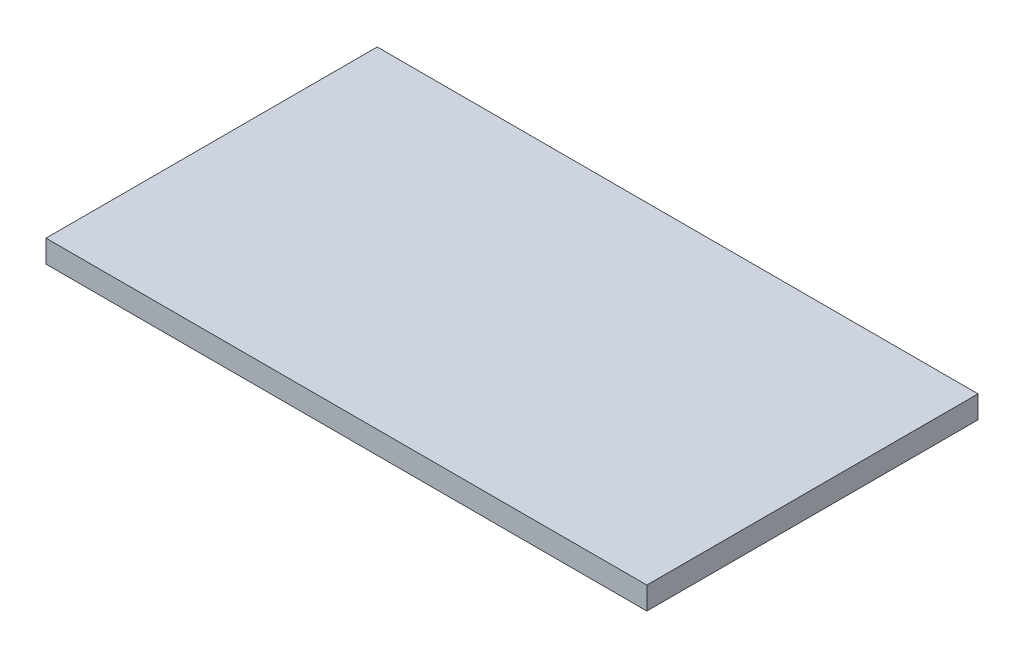
ISO-10303-21;
HEADER;
FILE_DESCRIPTION(('STEP AP214'),'2;1');
FILE_NAME('part.step','',(''),(''),'','','');
FILE_SCHEMA(('AUTOMOTIVE_DESIGN { 1 0 10303 214 1 1 1 1 }'));
ENDSEC;
DATA;
#1=APPLICATION_CONTEXT('core data for automotive mechanical design processes');
#2=APPLICATION_PROTOCOL_DEFINITION('international standard','automotive_design',2000,#1);
#3=PRODUCT_CONTEXT('',#1,'mechanical');
#4=PRODUCT('Part','Part','',(#3));
#5=PRODUCT_RELATED_PRODUCT_CATEGORY('part','',(#4));
#6=PRODUCT_DEFINITION_FORMATION('','',#4);
#7=PRODUCT_DEFINITION_CONTEXT('part definition',#1,'design');
#8=PRODUCT_DEFINITION('design','',#6,#7);
#9=PRODUCT_DEFINITION_SHAPE('','',#8);
#10=(LENGTH_UNIT() NAMED_UNIT(*) SI_UNIT(.MILLI.,.METRE.));
#11=(NAMED_UNIT(*) PLANE_ANGLE_UNIT() SI_UNIT($,.RADIAN.));
#12=(NAMED_UNIT(*) SI_UNIT($,.STERADIAN.) SOLID_ANGLE_UNIT());
#13=UNCERTAINTY_MEASURE_WITH_UNIT(LENGTH_MEASURE(1.E-05),#10,'distance_accuracy_value','');
#14=(GEOMETRIC_REPRESENTATION_CONTEXT(3) GLOBAL_UNCERTAINTY_ASSIGNED_CONTEXT((#13)) GLOBAL_UNIT_ASSIGNED_CONTEXT((#10,
#11,#12)) REPRESENTATION_CONTEXT('',''));
#15=CARTESIAN_POINT('',(0.,0.,0.));
#16=DIRECTION('',(0.,0.,1.));
#17=DIRECTION('',(1.,0.,0.));
#18=AXIS2_PLACEMENT_3D('',#15,#16,#17);
#19=CARTESIAN_POINT('',(0.,9.525,0.));
#20=DIRECTION('',(0.,0.,-1.));
#21=DIRECTION('',(-1.,0.,0.));
#22=AXIS2_PLACEMENT_3D('',#19,#20,#21);
#23=PLANE('',#22);
#24=DIRECTION('',(1.,0.,0.));
#25=VECTOR('',#24,1.);
#26=CARTESIAN_POINT('',(0.,0.,0.));
#27=LINE('',#26,#25);
#28=CARTESIAN_POINT('',(0.,0.,0.));
#29=VERTEX_POINT('',#28);
#30=CARTESIAN_POINT('',(254.,0.,0.));
#31=VERTEX_POINT('',#30);
#32=EDGE_CURVE('E100',#29,#31,#27,.T.);
#33=ORIENTED_EDGE('',*,*,#32,.T.);
#34=DIRECTION('',(0.,-1.,0.));
#35=VECTOR('',#34,1.);
#36=CARTESIAN_POINT('',(254.,9.525,0.));
#37=LINE('',#36,#35);
#38=CARTESIAN_POINT('',(254.,9.525,0.));
#39=VERTEX_POINT('',#38);
#40=EDGE_CURVE('E11',#39,#31,#37,.T.);
#41=ORIENTED_EDGE('',*,*,#40,.F.);
#42=DIRECTION('',(1.,0.,0.));
#43=VECTOR('',#42,1.);
#44=CARTESIAN_POINT('',(0.,9.525,0.));
#45=LINE('',#44,#43);
#46=CARTESIAN_POINT('',(0.,9.525,0.));
#47=VERTEX_POINT('',#46);
#48=EDGE_CURVE('E88',#47,#39,#45,.T.);
#49=ORIENTED_EDGE('',*,*,#48,.F.);
#50=DIRECTION('',(0.,-1.,0.));
#51=VECTOR('',#50,1.);
#52=CARTESIAN_POINT('',(0.,9.525,0.));
#53=LINE('',#52,#51);
#54=EDGE_CURVE('E96',#47,#29,#53,.T.);
#55=ORIENTED_EDGE('',*,*,#54,.T.);
#56=EDGE_LOOP('',(#33,#41,#49,#55));
#57=FACE_BOUND('',#56,.T.);
#58=ADVANCED_FACE('F37',(#57),#23,.F.);
#59=CARTESIAN_POINT('',(254.,9.525,-140.));
#60=DIRECTION('',(-1.,0.,0.));
#61=DIRECTION('',(0.,0.,1.));
#62=AXIS2_PLACEMENT_3D('',#59,#60,#61);
#63=PLANE('',#62);
#64=DIRECTION('',(0.,0.,-1.));
#65=VECTOR('',#64,1.);
#66=CARTESIAN_POINT('',(254.,0.,-140.));
#67=LINE('',#66,#65);
#68=CARTESIAN_POINT('',(254.,0.,-140.));
#69=VERTEX_POINT('',#68);
#70=EDGE_CURVE('E92',#31,#69,#67,.T.);
#71=ORIENTED_EDGE('',*,*,#70,.T.);
#72=DIRECTION('',(0.,-1.,0.));
#73=VECTOR('',#72,1.);
#74=CARTESIAN_POINT('',(254.,9.525,-140.));
#75=LINE('',#74,#73);
#76=CARTESIAN_POINT('',(254.,9.525,-140.));
#77=VERTEX_POINT('',#76);
#78=EDGE_CURVE('E45',#77,#69,#75,.T.);
#79=ORIENTED_EDGE('',*,*,#78,.F.);
#80=DIRECTION('',(0.,0.,-1.));
#81=VECTOR('',#80,1.);
#82=CARTESIAN_POINT('',(254.,9.525,-140.));
#83=LINE('',#82,#81);
#84=EDGE_CURVE('E83',#39,#77,#83,.T.);
#85=ORIENTED_EDGE('',*,*,#84,.F.);
#86=ORIENTED_EDGE('',*,*,#40,.T.);
#87=EDGE_LOOP('',(#71,#79,#85,#86));
#88=FACE_BOUND('',#87,.T.);
#89=ADVANCED_FACE('F91',(#88),#63,.F.);
#90=CARTESIAN_POINT('',(0.,9.525,-140.));
#91=DIRECTION('',(0.,0.,1.));
#92=DIRECTION('',(1.,0.,0.));
#93=AXIS2_PLACEMENT_3D('',#90,#91,#92);
#94=PLANE('',#93);
#95=DIRECTION('',(-1.,0.,0.));
#96=VECTOR('',#95,1.);
#97=CARTESIAN_POINT('',(0.,0.,-140.));
#98=LINE('',#97,#96);
#99=CARTESIAN_POINT('',(0.,0.,-140.));
#100=VERTEX_POINT('',#99);
#101=EDGE_CURVE('E70',#69,#100,#98,.T.);
#102=ORIENTED_EDGE('',*,*,#101,.T.);
#103=DIRECTION('',(0.,-1.,0.));
#104=VECTOR('',#103,1.);
#105=CARTESIAN_POINT('',(0.,9.525,-140.));
#106=LINE('',#105,#104);
#107=CARTESIAN_POINT('',(0.,9.525,-140.));
#108=VERTEX_POINT('',#107);
#109=EDGE_CURVE('E93',#108,#100,#106,.T.);
#110=ORIENTED_EDGE('',*,*,#109,.F.);
#111=DIRECTION('',(-1.,0.,0.));
#112=VECTOR('',#111,1.);
#113=CARTESIAN_POINT('',(0.,9.525,-140.));
#114=LINE('',#113,#112);
#115=EDGE_CURVE('E86',#77,#108,#114,.T.);
#116=ORIENTED_EDGE('',*,*,#115,.F.);
#117=ORIENTED_EDGE('',*,*,#78,.T.);
#118=EDGE_LOOP('',(#102,#110,#116,#117));
#119=FACE_BOUND('',#118,.T.);
#120=ADVANCED_FACE('F94',(#119),#94,.F.);
#121=CARTESIAN_POINT('',(0.,9.525,0.));
#122=DIRECTION('',(1.,0.,0.));
#123=DIRECTION('',(0.,0.,-1.));
#124=AXIS2_PLACEMENT_3D('',#121,#122,#123);
#125=PLANE('',#124);
#126=DIRECTION('',(0.,0.,1.));
#127=VECTOR('',#126,1.);
#128=CARTESIAN_POINT('',(0.,0.,0.));
#129=LINE('',#128,#127);
#130=EDGE_CURVE('E76',#100,#29,#129,.T.);
#131=ORIENTED_EDGE('',*,*,#130,.T.);
#132=ORIENTED_EDGE('',*,*,#54,.F.);
#133=DIRECTION('',(0.,0.,1.));
#134=VECTOR('',#133,1.);
#135=CARTESIAN_POINT('',(0.,9.525,0.));
#136=LINE('',#135,#134);
#137=EDGE_CURVE('E53',#108,#47,#136,.T.);
#138=ORIENTED_EDGE('',*,*,#137,.F.);
#139=ORIENTED_EDGE('',*,*,#109,.T.);
#140=EDGE_LOOP('',(#131,#132,#138,#139));
#141=FACE_BOUND('',#140,.T.);
#142=ADVANCED_FACE('F107',(#141),#125,.F.);
#143=CARTESIAN_POINT('',(0.,9.525,0.));
#144=DIRECTION('',(0.,-1.,0.));
#145=DIRECTION('',(0.,0.,-1.));
#146=AXIS2_PLACEMENT_3D('',#143,#144,#145);
#147=PLANE('',#146);
#148=ORIENTED_EDGE('',*,*,#48,.T.);
#149=ORIENTED_EDGE('',*,*,#84,.T.);
#150=ORIENTED_EDGE('',*,*,#115,.T.);
#151=ORIENTED_EDGE('',*,*,#137,.T.);
#152=EDGE_LOOP('',(#148,#149,#150,#151));
#153=FACE_BOUND('',#152,.T.);
#154=ADVANCED_FACE('F84',(#153),#147,.F.);
#155=CARTESIAN_POINT('',(0.,0.,0.));
#156=DIRECTION('',(0.,-1.,0.));
#157=DIRECTION('',(0.,0.,-1.));
#158=AXIS2_PLACEMENT_3D('',#155,#156,#157);
#159=PLANE('',#158);
#160=ORIENTED_EDGE('',*,*,#32,.F.);
#161=ORIENTED_EDGE('',*,*,#130,.F.);
#162=ORIENTED_EDGE('',*,*,#101,.F.);
#163=ORIENTED_EDGE('',*,*,#70,.F.);
#164=EDGE_LOOP('',(#160,#161,#162,#163));
#165=FACE_BOUND('',#164,.T.);
#166=ADVANCED_FACE('F110',(#165),#159,.T.);
#167=CLOSED_SHELL('',(#58,#89,#120,#142,#154,#166));
#168=MANIFOLD_SOLID_BREP('B2',#167);
#169=ADVANCED_BREP_SHAPE_REPRESENTATION('',(#18,#168),#14);
#170=SHAPE_DEFINITION_REPRESENTATION(#9,#169);
ENDSEC;
END-ISO-10303-21;
